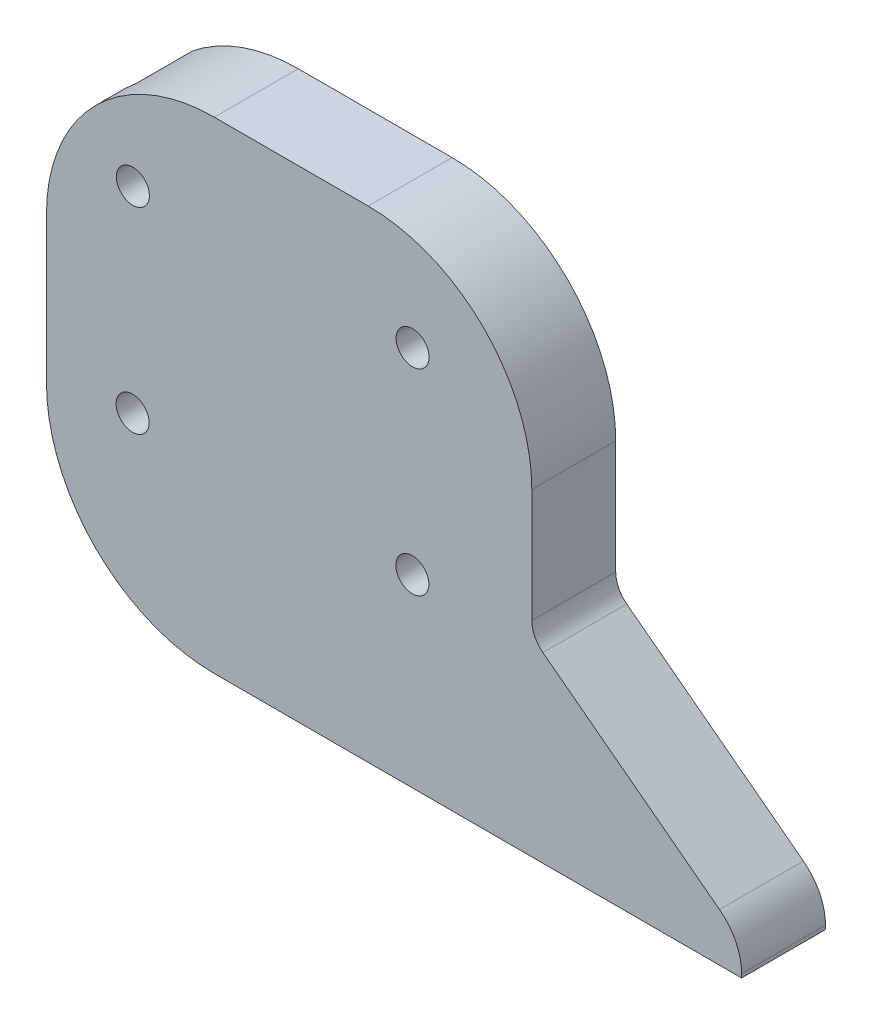
ISO-10303-21;
HEADER;
FILE_DESCRIPTION(('STEP AP214'),'2;1');
FILE_NAME('part.step','',(''),(''),'','','');
FILE_SCHEMA(('AUTOMOTIVE_DESIGN { 1 0 10303 214 1 1 1 1 }'));
ENDSEC;
DATA;
#1=APPLICATION_CONTEXT('core data for automotive mechanical design processes');
#2=APPLICATION_PROTOCOL_DEFINITION('international standard','automotive_design',2000,#1);
#3=PRODUCT_CONTEXT('',#1,'mechanical');
#4=PRODUCT('Part','Part','',(#3));
#5=PRODUCT_RELATED_PRODUCT_CATEGORY('part','',(#4));
#6=PRODUCT_DEFINITION_FORMATION('','',#4);
#7=PRODUCT_DEFINITION_CONTEXT('part definition',#1,'design');
#8=PRODUCT_DEFINITION('design','',#6,#7);
#9=PRODUCT_DEFINITION_SHAPE('','',#8);
#10=(LENGTH_UNIT() NAMED_UNIT(*) SI_UNIT(.MILLI.,.METRE.));
#11=(NAMED_UNIT(*) PLANE_ANGLE_UNIT() SI_UNIT($,.RADIAN.));
#12=(NAMED_UNIT(*) SI_UNIT($,.STERADIAN.) SOLID_ANGLE_UNIT());
#13=UNCERTAINTY_MEASURE_WITH_UNIT(LENGTH_MEASURE(1.E-05),#10,'distance_accuracy_value','');
#14=(GEOMETRIC_REPRESENTATION_CONTEXT(3) GLOBAL_UNCERTAINTY_ASSIGNED_CONTEXT((#13)) GLOBAL_UNIT_ASSIGNED_CONTEXT((#10,
#11,#12)) REPRESENTATION_CONTEXT('',''));
#15=CARTESIAN_POINT('',(0.,0.,0.));
#16=DIRECTION('',(0.,0.,1.));
#17=DIRECTION('',(1.,0.,0.));
#18=AXIS2_PLACEMENT_3D('',#15,#16,#17);
#19=CARTESIAN_POINT('',(0.,-14.7706705557306,-7.62));
#20=DIRECTION('',(0.,-1.,0.));
#21=DIRECTION('',(0.,0.,-1.));
#22=AXIS2_PLACEMENT_3D('',#19,#20,#21);
#23=PLANE('',#22);
#24=DIRECTION('',(1.,0.,0.));
#25=VECTOR('',#24,1.);
#26=CARTESIAN_POINT('',(0.,-14.7706705557306,-7.62));
#27=LINE('',#26,#25);
#28=CARTESIAN_POINT('',(-36.30945930322,-14.7706705557306,-7.62));
#29=VERTEX_POINT('',#28);
#30=CARTESIAN_POINT('',(3.08577359051926,-14.7706705557306,-7.62));
#31=VERTEX_POINT('',#30);
#32=EDGE_CURVE('E230',#29,#31,#27,.T.);
#33=ORIENTED_EDGE('',*,*,#32,.F.);
#34=DIRECTION('',(0.,0.,-1.));
#35=VECTOR('',#34,1.);
#36=CARTESIAN_POINT('',(-36.30945930322,-14.7706705557306,-7.62));
#37=LINE('',#36,#35);
#38=CARTESIAN_POINT('',(-36.30945930322,-14.7706705557306,-2.54));
#39=VERTEX_POINT('',#38);
#40=EDGE_CURVE('E279',#29,#39,#37,.F.);
#41=ORIENTED_EDGE('',*,*,#40,.T.);
#42=DIRECTION('',(1.,0.,0.));
#43=VECTOR('',#42,1.);
#44=CARTESIAN_POINT('',(0.,-14.7706705557306,-2.54));
#45=LINE('',#44,#43);
#46=CARTESIAN_POINT('',(3.08577359051926,-14.7706705557306,-2.54));
#47=VERTEX_POINT('',#46);
#48=EDGE_CURVE('E199',#39,#47,#45,.T.);
#49=ORIENTED_EDGE('',*,*,#48,.T.);
#50=DIRECTION('',(0.,0.,1.));
#51=VECTOR('',#50,1.);
#52=CARTESIAN_POINT('',(3.08577359051926,-14.7706705557306,-7.62));
#53=LINE('',#52,#51);
#54=EDGE_CURVE('E244',#31,#47,#53,.T.);
#55=ORIENTED_EDGE('',*,*,#54,.F.);
#56=EDGE_LOOP('',(#33,#41,#49,#55));
#57=FACE_BOUND('',#56,.T.);
#58=ADVANCED_FACE('F35',(#57),#23,.F.);
#59=CARTESIAN_POINT('',(3.08577359051926,0.,-7.62));
#60=DIRECTION('',(1.,0.,0.));
#61=DIRECTION('',(0.,0.,-1.));
#62=AXIS2_PLACEMENT_3D('',#59,#60,#61);
#63=PLANE('',#62);
#64=DIRECTION('',(0.,1.,0.));
#65=VECTOR('',#64,1.);
#66=CARTESIAN_POINT('',(3.08577359051926,0.,-2.54));
#67=LINE('',#66,#65);
#68=CARTESIAN_POINT('',(3.08577359051926,4.91432944426936,-2.54));
#69=VERTEX_POINT('',#68);
#70=EDGE_CURVE('E189',#47,#69,#67,.T.);
#71=ORIENTED_EDGE('',*,*,#70,.T.);
#72=DIRECTION('',(0.,0.,1.));
#73=VECTOR('',#72,1.);
#74=CARTESIAN_POINT('',(3.08577359051926,4.91432944426936,-7.62));
#75=LINE('',#74,#73);
#76=CARTESIAN_POINT('',(3.08577359051926,4.91432944426936,-7.62));
#77=VERTEX_POINT('',#76);
#78=EDGE_CURVE('E248',#77,#69,#75,.T.);
#79=ORIENTED_EDGE('',*,*,#78,.F.);
#80=DIRECTION('',(0.,1.,0.));
#81=VECTOR('',#80,1.);
#82=CARTESIAN_POINT('',(3.08577359051926,0.,-7.62));
#83=LINE('',#82,#81);
#84=EDGE_CURVE('E228',#31,#77,#83,.T.);
#85=ORIENTED_EDGE('',*,*,#84,.F.);
#86=ORIENTED_EDGE('',*,*,#54,.T.);
#87=EDGE_LOOP('',(#71,#79,#85,#86));
#88=FACE_BOUND('',#87,.T.);
#89=ADVANCED_FACE('F314',(#88),#63,.F.);
#90=CARTESIAN_POINT('',(-8.34422640948074,4.91432944426936,-7.62));
#91=DIRECTION('',(0.,0.,1.));
#92=DIRECTION('',(1.,0.,0.));
#93=AXIS2_PLACEMENT_3D('',#90,#91,#92);
#94=CYLINDRICAL_SURFACE('',#93,11.43);
#95=CARTESIAN_POINT('',(-8.34422640948074,4.91432944426936,-2.54));
#96=DIRECTION('',(0.,0.,1.));
#97=DIRECTION('',(1.,0.,0.));
#98=AXIS2_PLACEMENT_3D('',#95,#96,#97);
#99=CIRCLE('',#98,11.43);
#100=CARTESIAN_POINT('',(-8.34422640948074,16.3443294442694,-2.54));
#101=VERTEX_POINT('',#100);
#102=EDGE_CURVE('E191',#69,#101,#99,.T.);
#103=ORIENTED_EDGE('',*,*,#102,.T.);
#104=DIRECTION('',(0.,0.,1.));
#105=VECTOR('',#104,1.);
#106=CARTESIAN_POINT('',(-8.34422640948074,16.3443294442694,-7.62));
#107=LINE('',#106,#105);
#108=CARTESIAN_POINT('',(-8.34422640948074,16.3443294442694,-7.62));
#109=VERTEX_POINT('',#108);
#110=EDGE_CURVE('E251',#109,#101,#107,.T.);
#111=ORIENTED_EDGE('',*,*,#110,.F.);
#112=CARTESIAN_POINT('',(-8.34422640948074,4.91432944426936,-7.62));
#113=DIRECTION('',(0.,0.,1.));
#114=DIRECTION('',(1.,0.,0.));
#115=AXIS2_PLACEMENT_3D('',#112,#113,#114);
#116=CIRCLE('',#115,11.43);
#117=EDGE_CURVE('E226',#77,#109,#116,.T.);
#118=ORIENTED_EDGE('',*,*,#117,.F.);
#119=ORIENTED_EDGE('',*,*,#78,.T.);
#120=EDGE_LOOP('',(#103,#111,#118,#119));
#121=FACE_BOUND('',#120,.T.);
#122=ADVANCED_FACE('F320',(#121),#94,.F.);
#123=CARTESIAN_POINT('',(0.,16.3443294442694,-7.62));
#124=DIRECTION('',(0.,1.,0.));
#125=DIRECTION('',(0.,0.,1.));
#126=AXIS2_PLACEMENT_3D('',#123,#124,#125);
#127=PLANE('',#126);
#128=DIRECTION('',(-1.,0.,0.));
#129=VECTOR('',#128,1.);
#130=CARTESIAN_POINT('',(0.,16.3443294442694,-2.54));
#131=LINE('',#130,#129);
#132=CARTESIAN_POINT('',(-31.9453156002213,16.3443294442694,-2.54));
#133=VERTEX_POINT('',#132);
#134=EDGE_CURVE('E193',#101,#133,#131,.T.);
#135=ORIENTED_EDGE('',*,*,#134,.T.);
#136=DIRECTION('',(0.,0.,1.));
#137=VECTOR('',#136,1.);
#138=CARTESIAN_POINT('',(-31.9453156002213,16.3443294442694,-2.54));
#139=LINE('',#138,#137);
#140=CARTESIAN_POINT('',(-31.9453156002213,16.3443294442694,-7.62));
#141=VERTEX_POINT('',#140);
#142=EDGE_CURVE('E272',#133,#141,#139,.F.);
#143=ORIENTED_EDGE('',*,*,#142,.T.);
#144=DIRECTION('',(-1.,0.,0.));
#145=VECTOR('',#144,1.);
#146=CARTESIAN_POINT('',(0.,16.3443294442694,-7.62));
#147=LINE('',#146,#145);
#148=EDGE_CURVE('E223',#109,#141,#147,.T.);
#149=ORIENTED_EDGE('',*,*,#148,.F.);
#150=ORIENTED_EDGE('',*,*,#110,.T.);
#151=EDGE_LOOP('',(#135,#143,#149,#150));
#152=FACE_BOUND('',#151,.T.);
#153=ADVANCED_FACE('F330',(#152),#127,.F.);
#154=CARTESIAN_POINT('',(-37.5542264094807,0.,-7.62));
#155=DIRECTION('',(-1.,0.,0.));
#156=DIRECTION('',(0.,0.,1.));
#157=AXIS2_PLACEMENT_3D('',#154,#155,#156);
#158=PLANE('',#157);
#159=DIRECTION('',(0.,-1.,0.));
#160=VECTOR('',#159,1.);
#161=CARTESIAN_POINT('',(-37.5542264094807,0.,0.));
#162=LINE('',#161,#160);
#163=CARTESIAN_POINT('',(-37.5542264094807,4.53332944426936,0.));
#164=VERTEX_POINT('',#163);
#165=CARTESIAN_POINT('',(-37.5542264094807,-8.73817055573064,0.));
#166=VERTEX_POINT('',#165);
#167=EDGE_CURVE('E215',#164,#166,#162,.T.);
#168=ORIENTED_EDGE('',*,*,#167,.F.);
#169=DIRECTION('',(0.,0.,1.));
#170=VECTOR('',#169,1.);
#171=CARTESIAN_POINT('',(-37.5542264094807,4.53332944426936,-7.62));
#172=LINE('',#171,#170);
#173=CARTESIAN_POINT('',(-37.5542264094807,4.53332944426936,-2.54));
#174=VERTEX_POINT('',#173);
#175=EDGE_CURVE('E266',#164,#174,#172,.F.);
#176=ORIENTED_EDGE('',*,*,#175,.T.);
#177=DIRECTION('',(0.,-1.,0.));
#178=VECTOR('',#177,1.);
#179=CARTESIAN_POINT('',(-37.5542264094807,0.,-2.54));
#180=LINE('',#179,#178);
#181=CARTESIAN_POINT('',(-37.5542264094807,-8.73817055573064,-2.54));
#182=VERTEX_POINT('',#181);
#183=EDGE_CURVE('E196',#174,#182,#180,.T.);
#184=ORIENTED_EDGE('',*,*,#183,.T.);
#185=DIRECTION('',(0.,0.,-1.));
#186=VECTOR('',#185,1.);
#187=CARTESIAN_POINT('',(-37.5542264094807,-8.73817055573064,-7.62));
#188=LINE('',#187,#186);
#189=EDGE_CURVE('E264',#182,#166,#188,.F.);
#190=ORIENTED_EDGE('',*,*,#189,.T.);
#191=EDGE_LOOP('',(#168,#176,#184,#190));
#192=FACE_BOUND('',#191,.T.);
#193=ADVANCED_FACE('F325',(#192),#158,.T.);
#194=CARTESIAN_POINT('',(0.,19.7733294442694,-7.62));
#195=DIRECTION('',(0.,1.,0.));
#196=DIRECTION('',(0.,0.,1.));
#197=AXIS2_PLACEMENT_3D('',#194,#195,#196);
#198=PLANE('',#197);
#199=DIRECTION('',(-1.,0.,0.));
#200=VECTOR('',#199,1.);
#201=CARTESIAN_POINT('',(0.,19.7733294442694,-7.62));
#202=LINE('',#201,#200);
#203=CARTESIAN_POINT('',(-8.34422640948074,19.7733294442694,-7.62));
#204=VERTEX_POINT('',#203);
#205=CARTESIAN_POINT('',(-22.3142264094807,19.7733294442694,-7.62));
#206=VERTEX_POINT('',#205);
#207=EDGE_CURVE('E220',#204,#206,#202,.T.);
#208=ORIENTED_EDGE('',*,*,#207,.T.);
#209=DIRECTION('',(0.,0.,1.));
#210=VECTOR('',#209,1.);
#211=CARTESIAN_POINT('',(-22.3142264094807,19.7733294442694,-7.62));
#212=LINE('',#211,#210);
#213=CARTESIAN_POINT('',(-22.3142264094807,19.7733294442694,0.));
#214=VERTEX_POINT('',#213);
#215=EDGE_CURVE('E247',#206,#214,#212,.T.);
#216=ORIENTED_EDGE('',*,*,#215,.T.);
#217=DIRECTION('',(-1.,0.,0.));
#218=VECTOR('',#217,1.);
#219=CARTESIAN_POINT('',(0.,19.7733294442694,0.));
#220=LINE('',#219,#218);
#221=CARTESIAN_POINT('',(-8.34422640948074,19.7733294442694,0.));
#222=VERTEX_POINT('',#221);
#223=EDGE_CURVE('E239',#222,#214,#220,.T.);
#224=ORIENTED_EDGE('',*,*,#223,.F.);
#225=DIRECTION('',(0.,0.,1.));
#226=VECTOR('',#225,1.);
#227=CARTESIAN_POINT('',(-8.34422640948074,19.7733294442694,-7.62));
#228=LINE('',#227,#226);
#229=EDGE_CURVE('E254',#204,#222,#228,.T.);
#230=ORIENTED_EDGE('',*,*,#229,.F.);
#231=EDGE_LOOP('',(#208,#216,#224,#230));
#232=FACE_BOUND('',#231,.T.);
#233=ADVANCED_FACE('F335',(#232),#198,.T.);
#234=CARTESIAN_POINT('',(-8.34422640948074,4.91432944426936,-7.62));
#235=DIRECTION('',(0.,0.,1.));
#236=DIRECTION('',(1.,0.,0.));
#237=AXIS2_PLACEMENT_3D('',#234,#235,#236);
#238=CYLINDRICAL_SURFACE('',#237,14.859);
#239=CARTESIAN_POINT('',(-8.34422640948074,4.91432944426936,0.));
#240=DIRECTION('',(0.,0.,1.));
#241=DIRECTION('',(1.,0.,0.));
#242=AXIS2_PLACEMENT_3D('',#239,#240,#241);
#243=CIRCLE('',#242,14.859);
#244=CARTESIAN_POINT('',(6.51477359051926,4.91432944426936,0.));
#245=VERTEX_POINT('',#244);
#246=EDGE_CURVE('E236',#245,#222,#243,.T.);
#247=ORIENTED_EDGE('',*,*,#246,.F.);
#248=DIRECTION('',(0.,0.,1.));
#249=VECTOR('',#248,1.);
#250=CARTESIAN_POINT('',(6.51477359051926,4.91432944426936,-7.62));
#251=LINE('',#250,#249);
#252=CARTESIAN_POINT('',(6.51477359051926,4.91432944426936,-7.62));
#253=VERTEX_POINT('',#252);
#254=EDGE_CURVE('E232',#253,#245,#251,.T.);
#255=ORIENTED_EDGE('',*,*,#254,.F.);
#256=CARTESIAN_POINT('',(-8.34422640948074,4.91432944426936,-7.62));
#257=DIRECTION('',(0.,0.,1.));
#258=DIRECTION('',(1.,0.,0.));
#259=AXIS2_PLACEMENT_3D('',#256,#257,#258);
#260=CIRCLE('',#259,14.859);
#261=EDGE_CURVE('E217',#253,#204,#260,.T.);
#262=ORIENTED_EDGE('',*,*,#261,.T.);
#263=ORIENTED_EDGE('',*,*,#229,.T.);
#264=EDGE_LOOP('',(#247,#255,#262,#263));
#265=FACE_BOUND('',#264,.T.);
#266=ADVANCED_FACE('F338',(#265),#238,.T.);
#267=CARTESIAN_POINT('',(6.51477359051926,0.,-7.62));
#268=DIRECTION('',(1.,0.,0.));
#269=DIRECTION('',(0.,0.,-1.));
#270=AXIS2_PLACEMENT_3D('',#267,#268,#269);
#271=PLANE('',#270);
#272=DIRECTION('',(0.,1.,0.));
#273=VECTOR('',#272,1.);
#274=CARTESIAN_POINT('',(6.51477359051926,0.,0.));
#275=LINE('',#274,#273);
#276=CARTESIAN_POINT('',(6.51477359051926,-5.38276584301118,0.));
#277=VERTEX_POINT('',#276);
#278=EDGE_CURVE('E234',#277,#245,#275,.T.);
#279=ORIENTED_EDGE('',*,*,#278,.F.);
#280=DIRECTION('',(0.,0.,1.));
#281=VECTOR('',#280,1.);
#282=CARTESIAN_POINT('',(6.51477359051926,-5.38276584301118,-7.62));
#283=LINE('',#282,#281);
#284=CARTESIAN_POINT('',(6.51477359051926,-5.38276584301118,-7.62));
#285=VERTEX_POINT('',#284);
#286=EDGE_CURVE('E50',#277,#285,#283,.F.);
#287=ORIENTED_EDGE('',*,*,#286,.T.);
#288=DIRECTION('',(0.,1.,0.));
#289=VECTOR('',#288,1.);
#290=CARTESIAN_POINT('',(6.51477359051926,0.,-7.62));
#291=LINE('',#290,#289);
#292=EDGE_CURVE('E214',#285,#253,#291,.T.);
#293=ORIENTED_EDGE('',*,*,#292,.T.);
#294=ORIENTED_EDGE('',*,*,#254,.T.);
#295=EDGE_LOOP('',(#279,#287,#293,#294));
#296=FACE_BOUND('',#295,.T.);
#297=ADVANCED_FACE('F342',(#296),#271,.T.);
#298=CARTESIAN_POINT('',(-0.81484305050163,-1.07216190855478,-7.62));
#299=DIRECTION('',(-0.605083267533557,-0.796162194123103,0.));
#300=DIRECTION('',(0.796162194123104,-0.605083267533557,0.));
#301=AXIS2_PLACEMENT_3D('',#298,#299,#300);
#302=PLANE('',#301);
#303=DIRECTION('',(0.796162194123103,-0.605083267533557,0.));
#304=VECTOR('',#303,1.);
#305=CARTESIAN_POINT('',(-0.81484305050163,-1.07216190855478,-7.62));
#306=LINE('',#305,#304);
#307=CARTESIAN_POINT('',(7.51786209098402,-7.40501781608386,-7.62));
#308=VERTEX_POINT('',#307);
#309=CARTESIAN_POINT('',(23.5585965895897,-19.5959760350242,-7.62));
#310=VERTEX_POINT('',#309);
#311=EDGE_CURVE('E212',#308,#310,#306,.T.);
#312=ORIENTED_EDGE('',*,*,#311,.F.);
#313=DIRECTION('',(0.,0.,1.));
#314=VECTOR('',#313,1.);
#315=CARTESIAN_POINT('',(7.51786209098402,-7.40501781608386,-7.62));
#316=LINE('',#315,#314);
#317=CARTESIAN_POINT('',(7.51786209098402,-7.40501781608386,0.));
#318=VERTEX_POINT('',#317);
#319=EDGE_CURVE('E290',#308,#318,#316,.T.);
#320=ORIENTED_EDGE('',*,*,#319,.T.);
#321=DIRECTION('',(0.796162194123103,-0.605083267533557,0.));
#322=VECTOR('',#321,1.);
#323=CARTESIAN_POINT('',(-0.81484305050163,-1.07216190855478,0.));
#324=LINE('',#323,#322);
#325=CARTESIAN_POINT('',(23.5585965895897,-19.5959760350242,0.));
#326=VERTEX_POINT('',#325);
#327=EDGE_CURVE('E201',#318,#326,#324,.T.);
#328=ORIENTED_EDGE('',*,*,#327,.T.);
#329=DIRECTION('',(0.,0.,1.));
#330=VECTOR('',#329,1.);
#331=CARTESIAN_POINT('',(23.5585965895897,-19.5959760350242,-7.62));
#332=LINE('',#331,#330);
#333=EDGE_CURVE('E286',#326,#310,#332,.F.);
#334=ORIENTED_EDGE('',*,*,#333,.T.);
#335=EDGE_LOOP('',(#312,#320,#328,#334));
#336=FACE_BOUND('',#335,.T.);
#337=ADVANCED_FACE('F296',(#336),#302,.F.);
#338=CARTESIAN_POINT('',(0.,0.,-7.62));
#339=DIRECTION('',(0.,0.,1.));
#340=DIRECTION('',(1.,0.,0.));
#341=AXIS2_PLACEMENT_3D('',#338,#339,#340);
#342=PLANE('',#341);
#343=ORIENTED_EDGE('',*,*,#292,.F.);
#344=CARTESIAN_POINT('',(9.05477359051926,-5.38276584301118,-7.62));
#345=DIRECTION('',(0.,0.,1.));
#346=DIRECTION('',(1.,0.,0.));
#347=AXIS2_PLACEMENT_3D('',#344,#345,#346);
#348=CIRCLE('',#347,2.54);
#349=EDGE_CURVE('E11',#285,#308,#348,.T.);
#350=ORIENTED_EDGE('',*,*,#349,.T.);
#351=ORIENTED_EDGE('',*,*,#311,.T.);
#352=CARTESIAN_POINT('',(20.4847735905193,-23.6404799811695,-7.62));
#353=DIRECTION('',(0.,0.,1.));
#354=DIRECTION('',(1.,0.,0.));
#355=AXIS2_PLACEMENT_3D('',#352,#353,#354);
#356=CIRCLE('',#355,5.08);
#357=CARTESIAN_POINT('',(25.5647735905193,-23.6404799811695,-7.62));
#358=VERTEX_POINT('',#357);
#359=EDGE_CURVE('E151',#310,#358,#356,.F.);
#360=ORIENTED_EDGE('',*,*,#359,.T.);
#361=DIRECTION('',(0.,-1.,0.));
#362=VECTOR('',#361,1.);
#363=CARTESIAN_POINT('',(25.5647735905193,42.352031849768,-7.62));
#364=LINE('',#363,#362);
#365=CARTESIAN_POINT('',(25.5647735905193,-23.9781705557306,-7.62));
#366=VERTEX_POINT('',#365);
#367=EDGE_CURVE('E146',#358,#366,#364,.T.);
#368=ORIENTED_EDGE('',*,*,#367,.T.);
#369=DIRECTION('',(1.,0.,0.));
#370=VECTOR('',#369,1.);
#371=CARTESIAN_POINT('',(0.,-23.9781705557306,-7.62));
#372=LINE('',#371,#370);
#373=CARTESIAN_POINT('',(-22.3142264094807,-23.9781705557306,-7.62));
#374=VERTEX_POINT('',#373);
#375=EDGE_CURVE('E149',#374,#366,#372,.T.);
#376=ORIENTED_EDGE('',*,*,#375,.F.);
#377=CARTESIAN_POINT('',(-22.3142264094807,-8.73817055573064,-7.62));
#378=DIRECTION('',(0.,0.,1.));
#379=DIRECTION('',(1.,0.,0.));
#380=AXIS2_PLACEMENT_3D('',#377,#378,#379);
#381=CIRCLE('',#380,15.24);
#382=EDGE_CURVE('E274',#374,#29,#381,.F.);
#383=ORIENTED_EDGE('',*,*,#382,.T.);
#384=ORIENTED_EDGE('',*,*,#32,.T.);
#385=ORIENTED_EDGE('',*,*,#84,.T.);
#386=ORIENTED_EDGE('',*,*,#117,.T.);
#387=ORIENTED_EDGE('',*,*,#148,.T.);
#388=CARTESIAN_POINT('',(-22.3142264094807,4.53332944426936,-7.62));
#389=DIRECTION('',(0.,0.,1.));
#390=DIRECTION('',(1.,0.,0.));
#391=AXIS2_PLACEMENT_3D('',#388,#389,#390);
#392=CIRCLE('',#391,15.24);
#393=EDGE_CURVE('E276',#141,#206,#392,.F.);
#394=ORIENTED_EDGE('',*,*,#393,.T.);
#395=ORIENTED_EDGE('',*,*,#207,.F.);
#396=ORIENTED_EDGE('',*,*,#261,.F.);
#397=EDGE_LOOP('',(#343,#350,#351,#360,#368,#376,#383,#384,#385,#386,#387,#394,#395,#396));
#398=FACE_BOUND('',#397,.T.);
#399=ADVANCED_FACE('F148',(#398),#342,.F.);
#400=CARTESIAN_POINT('',(0.,0.,0.));
#401=DIRECTION('',(0.,0.,1.));
#402=DIRECTION('',(1.,0.,0.));
#403=AXIS2_PLACEMENT_3D('',#400,#401,#402);
#404=PLANE('',#403);
#405=DIRECTION('',(0.,-1.,0.));
#406=VECTOR('',#405,1.);
#407=CARTESIAN_POINT('',(25.5647735905193,42.352031849768,0.));
#408=LINE('',#407,#406);
#409=CARTESIAN_POINT('',(25.5647735905193,-23.6404799811695,0.));
#410=VERTEX_POINT('',#409);
#411=CARTESIAN_POINT('',(25.5647735905193,-23.9781705557306,0.));
#412=VERTEX_POINT('',#411);
#413=EDGE_CURVE('E157',#410,#412,#408,.T.);
#414=ORIENTED_EDGE('',*,*,#413,.F.);
#415=CARTESIAN_POINT('',(20.4847735905193,-23.6404799811695,0.));
#416=DIRECTION('',(0.,0.,1.));
#417=DIRECTION('',(1.,0.,0.));
#418=AXIS2_PLACEMENT_3D('',#415,#416,#417);
#419=CIRCLE('',#418,5.08);
#420=EDGE_CURVE('E283',#410,#326,#419,.T.);
#421=ORIENTED_EDGE('',*,*,#420,.T.);
#422=ORIENTED_EDGE('',*,*,#327,.F.);
#423=CARTESIAN_POINT('',(9.05477359051926,-5.38276584301118,0.));
#424=DIRECTION('',(0.,0.,1.));
#425=DIRECTION('',(1.,0.,0.));
#426=AXIS2_PLACEMENT_3D('',#423,#424,#425);
#427=CIRCLE('',#426,2.54);
#428=EDGE_CURVE('E43',#318,#277,#427,.F.);
#429=ORIENTED_EDGE('',*,*,#428,.T.);
#430=ORIENTED_EDGE('',*,*,#278,.T.);
#431=ORIENTED_EDGE('',*,*,#246,.T.);
#432=ORIENTED_EDGE('',*,*,#223,.T.);
#433=CARTESIAN_POINT('',(-22.3142264094807,4.53332944426936,0.));
#434=DIRECTION('',(0.,0.,1.));
#435=DIRECTION('',(1.,0.,0.));
#436=AXIS2_PLACEMENT_3D('',#433,#434,#435);
#437=CIRCLE('',#436,15.24);
#438=EDGE_CURVE('E262',#214,#164,#437,.T.);
#439=ORIENTED_EDGE('',*,*,#438,.T.);
#440=ORIENTED_EDGE('',*,*,#167,.T.);
#441=CARTESIAN_POINT('',(-22.3142264094807,-8.73817055573064,0.));
#442=DIRECTION('',(0.,0.,1.));
#443=DIRECTION('',(1.,0.,0.));
#444=AXIS2_PLACEMENT_3D('',#441,#442,#443);
#445=CIRCLE('',#444,15.24);
#446=CARTESIAN_POINT('',(-22.3142264094807,-23.9781705557306,0.));
#447=VERTEX_POINT('',#446);
#448=EDGE_CURVE('E260',#166,#447,#445,.T.);
#449=ORIENTED_EDGE('',*,*,#448,.T.);
#450=DIRECTION('',(-1.,0.,0.));
#451=VECTOR('',#450,1.);
#452=CARTESIAN_POINT('',(0.,-23.9781705557306,0.));
#453=LINE('',#452,#451);
#454=EDGE_CURVE('E171',#412,#447,#453,.T.);
#455=ORIENTED_EDGE('',*,*,#454,.F.);
#456=EDGE_LOOP('',(#414,#421,#422,#429,#430,#431,#432,#439,#440,#449,#455));
#457=FACE_BOUND('',#456,.T.);
#458=CARTESIAN_POINT('',(-29.7105052436959,10.645398587458,0.));
#459=DIRECTION('',(0.,0.,1.));
#460=DIRECTION('',(1.,0.,0.));
#461=AXIS2_PLACEMENT_3D('',#458,#459,#460);
#462=CIRCLE('',#461,1.5);
#463=CARTESIAN_POINT('',(-28.2105052436959,10.645398587458,0.));
#464=VERTEX_POINT('',#463);
#465=EDGE_CURVE('E156',#464,#464,#462,.T.);
#466=ORIENTED_EDGE('',*,*,#465,.F.);
#467=EDGE_LOOP('',(#466));
#468=FACE_BOUND('',#467,.T.);
#469=CARTESIAN_POINT('',(-4.31050524369592,10.645398587458,0.));
#470=DIRECTION('',(0.,0.,1.));
#471=DIRECTION('',(1.,0.,0.));
#472=AXIS2_PLACEMENT_3D('',#469,#470,#471);
#473=CIRCLE('',#472,1.5);
#474=CARTESIAN_POINT('',(-2.81050524369592,10.645398587458,0.));
#475=VERTEX_POINT('',#474);
#476=EDGE_CURVE('E204',#475,#475,#473,.T.);
#477=ORIENTED_EDGE('',*,*,#476,.F.);
#478=EDGE_LOOP('',(#477));
#479=FACE_BOUND('',#478,.T.);
#480=CARTESIAN_POINT('',(-29.732882342372,-7.21539776251841,0.));
#481=DIRECTION('',(0.,0.,1.));
#482=DIRECTION('',(1.,0.,0.));
#483=AXIS2_PLACEMENT_3D('',#480,#481,#482);
#484=CIRCLE('',#483,1.5);
#485=CARTESIAN_POINT('',(-28.232882342372,-7.21539776251841,0.));
#486=VERTEX_POINT('',#485);
#487=EDGE_CURVE('E207',#486,#486,#484,.T.);
#488=ORIENTED_EDGE('',*,*,#487,.F.);
#489=EDGE_LOOP('',(#488));
#490=FACE_BOUND('',#489,.T.);
#491=CARTESIAN_POINT('',(-4.33288234237199,-7.21539776251841,0.));
#492=DIRECTION('',(0.,0.,1.));
#493=DIRECTION('',(1.,0.,0.));
#494=AXIS2_PLACEMENT_3D('',#491,#492,#493);
#495=CIRCLE('',#494,1.5);
#496=CARTESIAN_POINT('',(-2.832882342372,-7.21539776251841,0.));
#497=VERTEX_POINT('',#496);
#498=EDGE_CURVE('E180',#497,#497,#495,.T.);
#499=ORIENTED_EDGE('',*,*,#498,.F.);
#500=EDGE_LOOP('',(#499));
#501=FACE_BOUND('',#500,.T.);
#502=ADVANCED_FACE('F299',(#457,#468,#479,#490,#501),#404,.T.);
#503=CARTESIAN_POINT('',(-4.33288234237199,-7.21539776251841,-2.54));
#504=DIRECTION('',(0.,0.,1.));
#505=DIRECTION('',(1.,0.,0.));
#506=AXIS2_PLACEMENT_3D('',#503,#504,#505);
#507=CYLINDRICAL_SURFACE('',#506,1.5);
#508=CARTESIAN_POINT('',(-4.33288234237199,-7.21539776251841,-2.54));
#509=DIRECTION('',(0.,0.,1.));
#510=DIRECTION('',(1.,0.,0.));
#511=AXIS2_PLACEMENT_3D('',#508,#509,#510);
#512=CIRCLE('',#511,1.5);
#513=CARTESIAN_POINT('',(-2.832882342372,-7.21539776251841,-2.54));
#514=VERTEX_POINT('',#513);
#515=EDGE_CURVE('E186',#514,#514,#512,.T.);
#516=ORIENTED_EDGE('',*,*,#515,.F.);
#517=EDGE_LOOP('',(#516));
#518=FACE_BOUND('',#517,.T.);
#519=ORIENTED_EDGE('',*,*,#498,.T.);
#520=EDGE_LOOP('',(#519));
#521=FACE_BOUND('',#520,.T.);
#522=ADVANCED_FACE('F418',(#518,#521),#507,.F.);
#523=CARTESIAN_POINT('',(-29.732882342372,-7.21539776251841,-2.54));
#524=DIRECTION('',(0.,0.,1.));
#525=DIRECTION('',(1.,0.,0.));
#526=AXIS2_PLACEMENT_3D('',#523,#524,#525);
#527=CYLINDRICAL_SURFACE('',#526,1.5);
#528=CARTESIAN_POINT('',(-29.732882342372,-7.21539776251841,-2.54));
#529=DIRECTION('',(0.,0.,1.));
#530=DIRECTION('',(1.,0.,0.));
#531=AXIS2_PLACEMENT_3D('',#528,#529,#530);
#532=CIRCLE('',#531,1.5);
#533=CARTESIAN_POINT('',(-28.232882342372,-7.21539776251841,-2.54));
#534=VERTEX_POINT('',#533);
#535=EDGE_CURVE('E183',#534,#534,#532,.T.);
#536=ORIENTED_EDGE('',*,*,#535,.F.);
#537=EDGE_LOOP('',(#536));
#538=FACE_BOUND('',#537,.T.);
#539=ORIENTED_EDGE('',*,*,#487,.T.);
#540=EDGE_LOOP('',(#539));
#541=FACE_BOUND('',#540,.T.);
#542=ADVANCED_FACE('F425',(#538,#541),#527,.F.);
#543=CARTESIAN_POINT('',(-4.31050524369592,10.645398587458,-2.54));
#544=DIRECTION('',(0.,0.,1.));
#545=DIRECTION('',(1.,0.,0.));
#546=AXIS2_PLACEMENT_3D('',#543,#544,#545);
#547=CYLINDRICAL_SURFACE('',#546,1.5);
#548=CARTESIAN_POINT('',(-4.31050524369592,10.645398587458,-2.54));
#549=DIRECTION('',(0.,0.,1.));
#550=DIRECTION('',(1.,0.,0.));
#551=AXIS2_PLACEMENT_3D('',#548,#549,#550);
#552=CIRCLE('',#551,1.5);
#553=CARTESIAN_POINT('',(-2.81050524369592,10.645398587458,-2.54));
#554=VERTEX_POINT('',#553);
#555=EDGE_CURVE('E179',#554,#554,#552,.T.);
#556=ORIENTED_EDGE('',*,*,#555,.F.);
#557=EDGE_LOOP('',(#556));
#558=FACE_BOUND('',#557,.T.);
#559=ORIENTED_EDGE('',*,*,#476,.T.);
#560=EDGE_LOOP('',(#559));
#561=FACE_BOUND('',#560,.T.);
#562=ADVANCED_FACE('F434',(#558,#561),#547,.F.);
#563=CARTESIAN_POINT('',(-29.7105052436959,10.645398587458,-2.54));
#564=DIRECTION('',(0.,0.,1.));
#565=DIRECTION('',(1.,0.,0.));
#566=AXIS2_PLACEMENT_3D('',#563,#564,#565);
#567=CYLINDRICAL_SURFACE('',#566,1.5);
#568=CARTESIAN_POINT('',(-29.7105052436959,10.645398587458,-2.54));
#569=DIRECTION('',(0.,0.,1.));
#570=DIRECTION('',(1.,0.,0.));
#571=AXIS2_PLACEMENT_3D('',#568,#569,#570);
#572=CIRCLE('',#571,1.5);
#573=CARTESIAN_POINT('',(-28.2105052436959,10.645398587458,-2.54));
#574=VERTEX_POINT('',#573);
#575=EDGE_CURVE('E176',#574,#574,#572,.T.);
#576=ORIENTED_EDGE('',*,*,#575,.F.);
#577=EDGE_LOOP('',(#576));
#578=FACE_BOUND('',#577,.T.);
#579=ORIENTED_EDGE('',*,*,#465,.T.);
#580=EDGE_LOOP('',(#579));
#581=FACE_BOUND('',#580,.T.);
#582=ADVANCED_FACE('F442',(#578,#581),#567,.F.);
#583=CARTESIAN_POINT('',(0.,0.,-2.54));
#584=DIRECTION('',(0.,0.,1.));
#585=DIRECTION('',(1.,0.,0.));
#586=AXIS2_PLACEMENT_3D('',#583,#584,#585);
#587=PLANE('',#586);
#588=ORIENTED_EDGE('',*,*,#575,.T.);
#589=EDGE_LOOP('',(#588));
#590=FACE_BOUND('',#589,.T.);
#591=ORIENTED_EDGE('',*,*,#555,.T.);
#592=EDGE_LOOP('',(#591));
#593=FACE_BOUND('',#592,.T.);
#594=ORIENTED_EDGE('',*,*,#535,.T.);
#595=EDGE_LOOP('',(#594));
#596=FACE_BOUND('',#595,.T.);
#597=ORIENTED_EDGE('',*,*,#515,.T.);
#598=EDGE_LOOP('',(#597));
#599=FACE_BOUND('',#598,.T.);
#600=ORIENTED_EDGE('',*,*,#183,.F.);
#601=CARTESIAN_POINT('',(-22.3142264094807,4.53332944426936,-2.54));
#602=DIRECTION('',(0.,0.,1.));
#603=DIRECTION('',(1.,0.,0.));
#604=AXIS2_PLACEMENT_3D('',#601,#602,#603);
#605=CIRCLE('',#604,15.24);
#606=EDGE_CURVE('E270',#174,#133,#605,.F.);
#607=ORIENTED_EDGE('',*,*,#606,.T.);
#608=ORIENTED_EDGE('',*,*,#134,.F.);
#609=ORIENTED_EDGE('',*,*,#102,.F.);
#610=ORIENTED_EDGE('',*,*,#70,.F.);
#611=ORIENTED_EDGE('',*,*,#48,.F.);
#612=CARTESIAN_POINT('',(-22.3142264094807,-8.73817055573064,-2.54));
#613=DIRECTION('',(0.,0.,1.));
#614=DIRECTION('',(1.,0.,0.));
#615=AXIS2_PLACEMENT_3D('',#612,#613,#614);
#616=CIRCLE('',#615,15.24);
#617=EDGE_CURVE('E268',#39,#182,#616,.F.);
#618=ORIENTED_EDGE('',*,*,#617,.T.);
#619=EDGE_LOOP('',(#600,#607,#608,#609,#610,#611,#618));
#620=FACE_BOUND('',#619,.T.);
#621=ADVANCED_FACE('F361',(#590,#593,#596,#599,#620),#587,.F.);
#622=CARTESIAN_POINT('',(25.5647735905193,42.352031849768,0.));
#623=DIRECTION('',(1.,0.,0.));
#624=DIRECTION('',(0.,0.,-1.));
#625=AXIS2_PLACEMENT_3D('',#622,#623,#624);
#626=PLANE('',#625);
#627=ORIENTED_EDGE('',*,*,#367,.F.);
#628=DIRECTION('',(0.,0.,1.));
#629=VECTOR('',#628,1.);
#630=CARTESIAN_POINT('',(25.5647735905193,-23.6404799811695,0.));
#631=LINE('',#630,#629);
#632=EDGE_CURVE('E281',#358,#410,#631,.T.);
#633=ORIENTED_EDGE('',*,*,#632,.T.);
#634=ORIENTED_EDGE('',*,*,#413,.T.);
#635=DIRECTION('',(0.,0.,1.));
#636=VECTOR('',#635,1.);
#637=CARTESIAN_POINT('',(25.5647735905193,-23.9781705557306,0.));
#638=LINE('',#637,#636);
#639=EDGE_CURVE('E164',#366,#412,#638,.T.);
#640=ORIENTED_EDGE('',*,*,#639,.F.);
#641=EDGE_LOOP('',(#627,#633,#634,#640));
#642=FACE_BOUND('',#641,.T.);
#643=ADVANCED_FACE('F169',(#642),#626,.T.);
#644=CARTESIAN_POINT('',(0.,-23.9781705557306,0.));
#645=DIRECTION('',(0.,-1.,0.));
#646=DIRECTION('',(0.,0.,-1.));
#647=AXIS2_PLACEMENT_3D('',#644,#645,#646);
#648=PLANE('',#647);
#649=ORIENTED_EDGE('',*,*,#454,.T.);
#650=DIRECTION('',(0.,0.,-1.));
#651=VECTOR('',#650,1.);
#652=CARTESIAN_POINT('',(-22.3142264094807,-23.9781705557306,0.));
#653=LINE('',#652,#651);
#654=EDGE_CURVE('E167',#447,#374,#653,.T.);
#655=ORIENTED_EDGE('',*,*,#654,.T.);
#656=ORIENTED_EDGE('',*,*,#375,.T.);
#657=ORIENTED_EDGE('',*,*,#639,.T.);
#658=EDGE_LOOP('',(#649,#655,#656,#657));
#659=FACE_BOUND('',#658,.T.);
#660=ADVANCED_FACE('F163',(#659),#648,.T.);
#661=CARTESIAN_POINT('',(-22.3142264094807,4.53332944426936,-7.62));
#662=DIRECTION('',(0.,0.,1.));
#663=DIRECTION('',(1.,0.,0.));
#664=AXIS2_PLACEMENT_3D('',#661,#662,#663);
#665=CYLINDRICAL_SURFACE('',#664,15.24);
#666=ORIENTED_EDGE('',*,*,#606,.F.);
#667=ORIENTED_EDGE('',*,*,#175,.F.);
#668=ORIENTED_EDGE('',*,*,#438,.F.);
#669=ORIENTED_EDGE('',*,*,#215,.F.);
#670=ORIENTED_EDGE('',*,*,#393,.F.);
#671=ORIENTED_EDGE('',*,*,#142,.F.);
#672=EDGE_LOOP('',(#666,#667,#668,#669,#670,#671));
#673=FACE_BOUND('',#672,.T.);
#674=ADVANCED_FACE('F310',(#673),#665,.T.);
#675=CARTESIAN_POINT('',(-22.3142264094807,-8.73817055573064,0.));
#676=DIRECTION('',(0.,0.,-1.));
#677=DIRECTION('',(-1.,0.,0.));
#678=AXIS2_PLACEMENT_3D('',#675,#676,#677);
#679=CYLINDRICAL_SURFACE('',#678,15.24);
#680=ORIENTED_EDGE('',*,*,#448,.F.);
#681=ORIENTED_EDGE('',*,*,#189,.F.);
#682=ORIENTED_EDGE('',*,*,#617,.F.);
#683=ORIENTED_EDGE('',*,*,#40,.F.);
#684=ORIENTED_EDGE('',*,*,#382,.F.);
#685=ORIENTED_EDGE('',*,*,#654,.F.);
#686=EDGE_LOOP('',(#680,#681,#682,#683,#684,#685));
#687=FACE_BOUND('',#686,.T.);
#688=ADVANCED_FACE('F305',(#687),#679,.T.);
#689=CARTESIAN_POINT('',(20.4847735905193,-23.6404799811695,0.));
#690=DIRECTION('',(0.,0.,-1.));
#691=DIRECTION('',(-1.,0.,0.));
#692=AXIS2_PLACEMENT_3D('',#689,#690,#691);
#693=CYLINDRICAL_SURFACE('',#692,5.08);
#694=ORIENTED_EDGE('',*,*,#359,.F.);
#695=ORIENTED_EDGE('',*,*,#333,.F.);
#696=ORIENTED_EDGE('',*,*,#420,.F.);
#697=ORIENTED_EDGE('',*,*,#632,.F.);
#698=EDGE_LOOP('',(#694,#695,#696,#697));
#699=FACE_BOUND('',#698,.T.);
#700=ADVANCED_FACE('F303',(#699),#693,.T.);
#701=CARTESIAN_POINT('',(9.05477359051926,-5.38276584301118,-7.62));
#702=DIRECTION('',(0.,0.,1.));
#703=DIRECTION('',(1.,0.,0.));
#704=AXIS2_PLACEMENT_3D('',#701,#702,#703);
#705=CYLINDRICAL_SURFACE('',#704,2.54);
#706=ORIENTED_EDGE('',*,*,#349,.F.);
#707=ORIENTED_EDGE('',*,*,#286,.F.);
#708=ORIENTED_EDGE('',*,*,#428,.F.);
#709=ORIENTED_EDGE('',*,*,#319,.F.);
#710=EDGE_LOOP('',(#706,#707,#708,#709));
#711=FACE_BOUND('',#710,.T.);
#712=ADVANCED_FACE('F37',(#711),#705,.F.);
#713=CLOSED_SHELL('',(#58,#89,#122,#153,#193,#233,#266,#297,#337,#399,#502,#522,#542,#562,#582,
#621,#643,#660,#674,#688,#700,#712));
#714=MANIFOLD_SOLID_BREP('B2',#713);
#715=ADVANCED_BREP_SHAPE_REPRESENTATION('',(#18,#714),#14);
#716=SHAPE_DEFINITION_REPRESENTATION(#9,#715);
ENDSEC;
END-ISO-10303-21;
